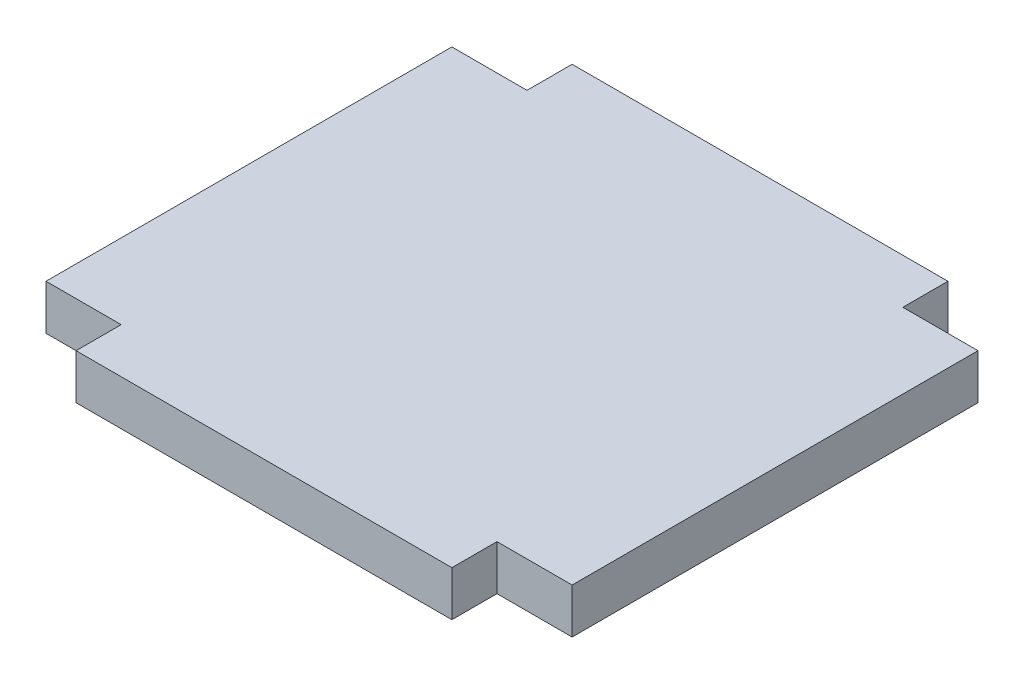
ISO-10303-21;
HEADER;
FILE_DESCRIPTION(('STEP AP214'),'2;1');
FILE_NAME('part.step','',(''),(''),'','','');
FILE_SCHEMA(('AUTOMOTIVE_DESIGN { 1 0 10303 214 1 1 1 1 }'));
ENDSEC;
DATA;
#1=APPLICATION_CONTEXT('core data for automotive mechanical design processes');
#2=APPLICATION_PROTOCOL_DEFINITION('international standard','automotive_design',2000,#1);
#3=PRODUCT_CONTEXT('',#1,'mechanical');
#4=PRODUCT('Part','Part','',(#3));
#5=PRODUCT_RELATED_PRODUCT_CATEGORY('part','',(#4));
#6=PRODUCT_DEFINITION_FORMATION('','',#4);
#7=PRODUCT_DEFINITION_CONTEXT('part definition',#1,'design');
#8=PRODUCT_DEFINITION('design','',#6,#7);
#9=PRODUCT_DEFINITION_SHAPE('','',#8);
#10=(LENGTH_UNIT() NAMED_UNIT(*) SI_UNIT(.MILLI.,.METRE.));
#11=(NAMED_UNIT(*) PLANE_ANGLE_UNIT() SI_UNIT($,.RADIAN.));
#12=(NAMED_UNIT(*) SI_UNIT($,.STERADIAN.) SOLID_ANGLE_UNIT());
#13=UNCERTAINTY_MEASURE_WITH_UNIT(LENGTH_MEASURE(1.E-05),#10,'distance_accuracy_value','');
#14=(GEOMETRIC_REPRESENTATION_CONTEXT(3) GLOBAL_UNCERTAINTY_ASSIGNED_CONTEXT((#13)) GLOBAL_UNIT_ASSIGNED_CONTEXT((#10,
#11,#12)) REPRESENTATION_CONTEXT('',''));
#15=CARTESIAN_POINT('',(0.,0.,0.));
#16=DIRECTION('',(0.,0.,1.));
#17=DIRECTION('',(1.,0.,0.));
#18=AXIS2_PLACEMENT_3D('',#15,#16,#17);
#19=CARTESIAN_POINT('',(23.,-53.,55.1793566240283));
#20=DIRECTION('',(1.,0.,0.));
#21=DIRECTION('',(0.,0.,-1.));
#22=AXIS2_PLACEMENT_3D('',#19,#20,#21);
#23=PLANE('',#22);
#24=DIRECTION('',(0.,0.,-1.));
#25=VECTOR('',#24,1.);
#26=CARTESIAN_POINT('',(23.,-56.,55.1793566240283));
#27=LINE('',#26,#25);
#28=CARTESIAN_POINT('',(23.,-56.,0.));
#29=VERTEX_POINT('',#28);
#30=CARTESIAN_POINT('',(23.,-56.,-3.));
#31=VERTEX_POINT('',#30);
#32=EDGE_CURVE('E369',#29,#31,#27,.T.);
#33=ORIENTED_EDGE('',*,*,#32,.F.);
#34=DIRECTION('',(0.,1.,0.));
#35=VECTOR('',#34,1.);
#36=CARTESIAN_POINT('',(23.,-53.,0.));
#37=LINE('',#36,#35);
#38=CARTESIAN_POINT('',(23.,-53.,0.));
#39=VERTEX_POINT('',#38);
#40=EDGE_CURVE('E161',#29,#39,#37,.T.);
#41=ORIENTED_EDGE('',*,*,#40,.T.);
#42=DIRECTION('',(0.,0.,-1.));
#43=VECTOR('',#42,1.);
#44=CARTESIAN_POINT('',(23.,-53.,55.1793566240283));
#45=LINE('',#44,#43);
#46=CARTESIAN_POINT('',(23.,-53.,-3.00000000000001));
#47=VERTEX_POINT('',#46);
#48=EDGE_CURVE('E210',#39,#47,#45,.T.);
#49=ORIENTED_EDGE('',*,*,#48,.T.);
#50=DIRECTION('',(0.,1.,0.));
#51=VECTOR('',#50,1.);
#52=CARTESIAN_POINT('',(23.,-53.,-3.));
#53=LINE('',#52,#51);
#54=EDGE_CURVE('E318',#31,#47,#53,.T.);
#55=ORIENTED_EDGE('',*,*,#54,.F.);
#56=EDGE_LOOP('',(#33,#41,#49,#55));
#57=FACE_BOUND('',#56,.T.);
#58=ADVANCED_FACE('F39',(#57),#23,.F.);
#59=CARTESIAN_POINT('',(48.,-53.,55.1793566240283));
#60=DIRECTION('',(-1.,0.,0.));
#61=DIRECTION('',(0.,0.,1.));
#62=AXIS2_PLACEMENT_3D('',#59,#60,#61);
#63=PLANE('',#62);
#64=DIRECTION('',(0.,1.,0.));
#65=VECTOR('',#64,1.);
#66=CARTESIAN_POINT('',(48.,-53.,0.));
#67=LINE('',#66,#65);
#68=CARTESIAN_POINT('',(48.,-56.,0.));
#69=VERTEX_POINT('',#68);
#70=CARTESIAN_POINT('',(48.,-53.,0.));
#71=VERTEX_POINT('',#70);
#72=EDGE_CURVE('E70',#69,#71,#67,.T.);
#73=ORIENTED_EDGE('',*,*,#72,.F.);
#74=DIRECTION('',(0.,0.,-1.));
#75=VECTOR('',#74,1.);
#76=CARTESIAN_POINT('',(48.,-56.,55.1793566240283));
#77=LINE('',#76,#75);
#78=CARTESIAN_POINT('',(48.,-56.,-3.));
#79=VERTEX_POINT('',#78);
#80=EDGE_CURVE('E349',#69,#79,#77,.T.);
#81=ORIENTED_EDGE('',*,*,#80,.T.);
#82=DIRECTION('',(0.,-1.,0.));
#83=VECTOR('',#82,1.);
#84=CARTESIAN_POINT('',(48.,-53.,-3.));
#85=LINE('',#84,#83);
#86=CARTESIAN_POINT('',(48.,-53.,-3.));
#87=VERTEX_POINT('',#86);
#88=EDGE_CURVE('E371',#87,#79,#85,.T.);
#89=ORIENTED_EDGE('',*,*,#88,.F.);
#90=DIRECTION('',(0.,0.,-1.));
#91=VECTOR('',#90,1.);
#92=CARTESIAN_POINT('',(48.,-53.,55.1793566240283));
#93=LINE('',#92,#91);
#94=EDGE_CURVE('E229',#71,#87,#93,.T.);
#95=ORIENTED_EDGE('',*,*,#94,.F.);
#96=EDGE_LOOP('',(#73,#81,#89,#95));
#97=FACE_BOUND('',#96,.T.);
#98=ADVANCED_FACE('F41',(#97),#63,.F.);
#99=DIRECTION('',(0.,-1.,0.));
#100=VECTOR('',#99,1.);
#101=CARTESIAN_POINT('',(48.,-53.,27.));
#102=LINE('',#101,#100);
#103=CARTESIAN_POINT('',(48.,-53.,27.));
#104=VERTEX_POINT('',#103);
#105=CARTESIAN_POINT('',(48.,-56.,27.));
#106=VERTEX_POINT('',#105);
#107=EDGE_CURVE('E315',#104,#106,#102,.T.);
#108=ORIENTED_EDGE('',*,*,#107,.F.);
#109=CARTESIAN_POINT('',(48.,-53.,30.));
#110=VERTEX_POINT('',#109);
#111=EDGE_CURVE('E231',#110,#104,#93,.T.);
#112=ORIENTED_EDGE('',*,*,#111,.F.);
#113=DIRECTION('',(0.,-1.,0.));
#114=VECTOR('',#113,1.);
#115=CARTESIAN_POINT('',(48.,-53.,30.));
#116=LINE('',#115,#114);
#117=CARTESIAN_POINT('',(48.,-56.,30.));
#118=VERTEX_POINT('',#117);
#119=EDGE_CURVE('E11',#110,#118,#116,.T.);
#120=ORIENTED_EDGE('',*,*,#119,.T.);
#121=EDGE_CURVE('E367',#118,#106,#77,.T.);
#122=ORIENTED_EDGE('',*,*,#121,.T.);
#123=EDGE_LOOP('',(#108,#112,#120,#122));
#124=FACE_BOUND('',#123,.T.);
#125=ADVANCED_FACE('F274',(#124),#63,.F.);
#126=CARTESIAN_POINT('',(48.,-56.,55.1793566240283));
#127=DIRECTION('',(0.,1.,0.));
#128=DIRECTION('',(-1.,0.,0.));
#129=AXIS2_PLACEMENT_3D('',#126,#127,#128);
#130=PLANE('',#129);
#131=ORIENTED_EDGE('',*,*,#121,.F.);
#132=DIRECTION('',(-1.,0.,0.));
#133=VECTOR('',#132,1.);
#134=CARTESIAN_POINT('',(48.,-56.,30.));
#135=LINE('',#134,#133);
#136=CARTESIAN_POINT('',(23.,-56.,30.));
#137=VERTEX_POINT('',#136);
#138=EDGE_CURVE('E225',#118,#137,#135,.T.);
#139=ORIENTED_EDGE('',*,*,#138,.T.);
#140=CARTESIAN_POINT('',(23.,-56.,27.));
#141=VERTEX_POINT('',#140);
#142=EDGE_CURVE('E215',#137,#141,#27,.T.);
#143=ORIENTED_EDGE('',*,*,#142,.T.);
#144=DIRECTION('',(1.,0.,0.));
#145=VECTOR('',#144,1.);
#146=CARTESIAN_POINT('',(18.,-56.,27.));
#147=LINE('',#146,#145);
#148=CARTESIAN_POINT('',(18.,-56.,27.));
#149=VERTEX_POINT('',#148);
#150=EDGE_CURVE('E60',#149,#141,#147,.T.);
#151=ORIENTED_EDGE('',*,*,#150,.F.);
#152=DIRECTION('',(0.,0.,-1.));
#153=VECTOR('',#152,1.);
#154=CARTESIAN_POINT('',(18.,-56.,0.));
#155=LINE('',#154,#153);
#156=CARTESIAN_POINT('',(18.,-56.,0.));
#157=VERTEX_POINT('',#156);
#158=EDGE_CURVE('E170',#149,#157,#155,.T.);
#159=ORIENTED_EDGE('',*,*,#158,.T.);
#160=DIRECTION('',(1.,0.,0.));
#161=VECTOR('',#160,1.);
#162=CARTESIAN_POINT('',(18.,-56.,0.));
#163=LINE('',#162,#161);
#164=EDGE_CURVE('E155',#157,#29,#163,.T.);
#165=ORIENTED_EDGE('',*,*,#164,.T.);
#166=ORIENTED_EDGE('',*,*,#32,.T.);
#167=DIRECTION('',(-1.,0.,0.));
#168=VECTOR('',#167,1.);
#169=CARTESIAN_POINT('',(48.,-56.,-3.));
#170=LINE('',#169,#168);
#171=EDGE_CURVE('E324',#79,#31,#170,.T.);
#172=ORIENTED_EDGE('',*,*,#171,.F.);
#173=ORIENTED_EDGE('',*,*,#80,.F.);
#174=DIRECTION('',(-1.,0.,0.));
#175=VECTOR('',#174,1.);
#176=CARTESIAN_POINT('',(53.,-56.,0.));
#177=LINE('',#176,#175);
#178=CARTESIAN_POINT('',(53.,-56.,0.));
#179=VERTEX_POINT('',#178);
#180=EDGE_CURVE('E336',#179,#69,#177,.T.);
#181=ORIENTED_EDGE('',*,*,#180,.F.);
#182=DIRECTION('',(0.,0.,-1.));
#183=VECTOR('',#182,1.);
#184=CARTESIAN_POINT('',(53.,-56.,0.));
#185=LINE('',#184,#183);
#186=CARTESIAN_POINT('',(53.,-56.,27.));
#187=VERTEX_POINT('',#186);
#188=EDGE_CURVE('E312',#187,#179,#185,.T.);
#189=ORIENTED_EDGE('',*,*,#188,.F.);
#190=DIRECTION('',(-1.,0.,0.));
#191=VECTOR('',#190,1.);
#192=CARTESIAN_POINT('',(53.,-56.,27.));
#193=LINE('',#192,#191);
#194=EDGE_CURVE('E327',#187,#106,#193,.T.);
#195=ORIENTED_EDGE('',*,*,#194,.T.);
#196=EDGE_LOOP('',(#131,#139,#143,#151,#159,#165,#166,#172,#173,#181,#189,#195));
#197=FACE_BOUND('',#196,.T.);
#198=ADVANCED_FACE('F177',(#197),#130,.F.);
#199=CARTESIAN_POINT('',(23.,-53.,30.));
#200=VERTEX_POINT('',#199);
#201=CARTESIAN_POINT('',(23.,-53.,27.));
#202=VERTEX_POINT('',#201);
#203=EDGE_CURVE('E214',#200,#202,#45,.T.);
#204=ORIENTED_EDGE('',*,*,#203,.T.);
#205=DIRECTION('',(0.,-1.,0.));
#206=VECTOR('',#205,1.);
#207=CARTESIAN_POINT('',(23.,-53.,27.));
#208=LINE('',#207,#206);
#209=EDGE_CURVE('E174',#202,#141,#208,.T.);
#210=ORIENTED_EDGE('',*,*,#209,.T.);
#211=ORIENTED_EDGE('',*,*,#142,.F.);
#212=DIRECTION('',(0.,1.,0.));
#213=VECTOR('',#212,1.);
#214=CARTESIAN_POINT('',(23.,-53.,30.));
#215=LINE('',#214,#213);
#216=EDGE_CURVE('E242',#137,#200,#215,.T.);
#217=ORIENTED_EDGE('',*,*,#216,.T.);
#218=EDGE_LOOP('',(#204,#210,#211,#217));
#219=FACE_BOUND('',#218,.T.);
#220=ADVANCED_FACE('F255',(#219),#23,.F.);
#221=CARTESIAN_POINT('',(48.,-53.,55.1793566240283));
#222=DIRECTION('',(0.,-1.,0.));
#223=DIRECTION('',(0.,0.,-1.));
#224=AXIS2_PLACEMENT_3D('',#221,#222,#223);
#225=PLANE('',#224);
#226=ORIENTED_EDGE('',*,*,#203,.F.);
#227=DIRECTION('',(1.,0.,0.));
#228=VECTOR('',#227,1.);
#229=CARTESIAN_POINT('',(48.,-53.,30.));
#230=LINE('',#229,#228);
#231=EDGE_CURVE('E49',#200,#110,#230,.T.);
#232=ORIENTED_EDGE('',*,*,#231,.T.);
#233=ORIENTED_EDGE('',*,*,#111,.T.);
#234=DIRECTION('',(-1.,0.,0.));
#235=VECTOR('',#234,1.);
#236=CARTESIAN_POINT('',(53.,-53.,27.));
#237=LINE('',#236,#235);
#238=CARTESIAN_POINT('',(53.,-53.,27.));
#239=VERTEX_POINT('',#238);
#240=EDGE_CURVE('E319',#239,#104,#237,.T.);
#241=ORIENTED_EDGE('',*,*,#240,.F.);
#242=DIRECTION('',(0.,0.,1.));
#243=VECTOR('',#242,1.);
#244=CARTESIAN_POINT('',(53.,-53.,0.));
#245=LINE('',#244,#243);
#246=CARTESIAN_POINT('',(53.,-53.,0.));
#247=VERTEX_POINT('',#246);
#248=EDGE_CURVE('E310',#247,#239,#245,.T.);
#249=ORIENTED_EDGE('',*,*,#248,.F.);
#250=DIRECTION('',(-1.,0.,0.));
#251=VECTOR('',#250,1.);
#252=CARTESIAN_POINT('',(53.,-53.,0.));
#253=LINE('',#252,#251);
#254=EDGE_CURVE('E316',#247,#71,#253,.T.);
#255=ORIENTED_EDGE('',*,*,#254,.T.);
#256=ORIENTED_EDGE('',*,*,#94,.T.);
#257=DIRECTION('',(1.,0.,0.));
#258=VECTOR('',#257,1.);
#259=CARTESIAN_POINT('',(48.,-53.,-3.));
#260=LINE('',#259,#258);
#261=EDGE_CURVE('E368',#47,#87,#260,.T.);
#262=ORIENTED_EDGE('',*,*,#261,.F.);
#263=ORIENTED_EDGE('',*,*,#48,.F.);
#264=DIRECTION('',(1.,0.,0.));
#265=VECTOR('',#264,1.);
#266=CARTESIAN_POINT('',(18.,-53.,0.));
#267=LINE('',#266,#265);
#268=CARTESIAN_POINT('',(18.,-53.,0.));
#269=VERTEX_POINT('',#268);
#270=EDGE_CURVE('E187',#269,#39,#267,.T.);
#271=ORIENTED_EDGE('',*,*,#270,.F.);
#272=DIRECTION('',(0.,0.,1.));
#273=VECTOR('',#272,1.);
#274=CARTESIAN_POINT('',(18.,-53.,0.));
#275=LINE('',#274,#273);
#276=CARTESIAN_POINT('',(18.,-53.,27.));
#277=VERTEX_POINT('',#276);
#278=EDGE_CURVE('E172',#269,#277,#275,.T.);
#279=ORIENTED_EDGE('',*,*,#278,.T.);
#280=DIRECTION('',(1.,0.,0.));
#281=VECTOR('',#280,1.);
#282=CARTESIAN_POINT('',(18.,-53.,27.));
#283=LINE('',#282,#281);
#284=EDGE_CURVE('E199',#277,#202,#283,.T.);
#285=ORIENTED_EDGE('',*,*,#284,.T.);
#286=EDGE_LOOP('',(#226,#232,#233,#241,#249,#255,#256,#262,#263,#271,#279,#285));
#287=FACE_BOUND('',#286,.T.);
#288=ADVANCED_FACE('F257',(#287),#225,.F.);
#289=CARTESIAN_POINT('',(35.5,0.,30.));
#290=DIRECTION('',(0.,0.,-1.));
#291=DIRECTION('',(1.,0.,0.));
#292=AXIS2_PLACEMENT_3D('',#289,#290,#291);
#293=PLANE('',#292);
#294=ORIENTED_EDGE('',*,*,#231,.F.);
#295=ORIENTED_EDGE('',*,*,#216,.F.);
#296=ORIENTED_EDGE('',*,*,#138,.F.);
#297=ORIENTED_EDGE('',*,*,#119,.F.);
#298=EDGE_LOOP('',(#294,#295,#296,#297));
#299=FACE_BOUND('',#298,.T.);
#300=ADVANCED_FACE('F281',(#299),#293,.F.);
#301=CARTESIAN_POINT('',(0.,0.,-3.));
#302=DIRECTION('',(0.,0.,1.));
#303=DIRECTION('',(0.,-1.,0.));
#304=AXIS2_PLACEMENT_3D('',#301,#302,#303);
#305=PLANE('',#304);
#306=ORIENTED_EDGE('',*,*,#88,.T.);
#307=ORIENTED_EDGE('',*,*,#171,.T.);
#308=ORIENTED_EDGE('',*,*,#54,.T.);
#309=ORIENTED_EDGE('',*,*,#261,.T.);
#310=EDGE_LOOP('',(#306,#307,#308,#309));
#311=FACE_BOUND('',#310,.T.);
#312=ADVANCED_FACE('F289',(#311),#305,.F.);
#313=CARTESIAN_POINT('',(53.,-53.,0.));
#314=DIRECTION('',(0.,0.,1.));
#315=DIRECTION('',(1.,0.,0.));
#316=AXIS2_PLACEMENT_3D('',#313,#314,#315);
#317=PLANE('',#316);
#318=ORIENTED_EDGE('',*,*,#72,.T.);
#319=ORIENTED_EDGE('',*,*,#254,.F.);
#320=DIRECTION('',(0.,1.,0.));
#321=VECTOR('',#320,1.);
#322=CARTESIAN_POINT('',(53.,-53.,0.));
#323=LINE('',#322,#321);
#324=EDGE_CURVE('E308',#179,#247,#323,.T.);
#325=ORIENTED_EDGE('',*,*,#324,.F.);
#326=ORIENTED_EDGE('',*,*,#180,.T.);
#327=EDGE_LOOP('',(#318,#319,#325,#326));
#328=FACE_BOUND('',#327,.T.);
#329=ADVANCED_FACE('F293',(#328),#317,.F.);
#330=CARTESIAN_POINT('',(53.,-53.,27.));
#331=DIRECTION('',(0.,0.,-1.));
#332=DIRECTION('',(-1.,0.,0.));
#333=AXIS2_PLACEMENT_3D('',#330,#331,#332);
#334=PLANE('',#333);
#335=ORIENTED_EDGE('',*,*,#107,.T.);
#336=ORIENTED_EDGE('',*,*,#194,.F.);
#337=DIRECTION('',(0.,-1.,0.));
#338=VECTOR('',#337,1.);
#339=CARTESIAN_POINT('',(53.,-53.,27.));
#340=LINE('',#339,#338);
#341=EDGE_CURVE('E358',#239,#187,#340,.T.);
#342=ORIENTED_EDGE('',*,*,#341,.F.);
#343=ORIENTED_EDGE('',*,*,#240,.T.);
#344=EDGE_LOOP('',(#335,#336,#342,#343));
#345=FACE_BOUND('',#344,.T.);
#346=ADVANCED_FACE('F297',(#345),#334,.F.);
#347=CARTESIAN_POINT('',(53.,0.,0.));
#348=DIRECTION('',(-1.,0.,0.));
#349=DIRECTION('',(0.,0.,1.));
#350=AXIS2_PLACEMENT_3D('',#347,#348,#349);
#351=PLANE('',#350);
#352=ORIENTED_EDGE('',*,*,#324,.T.);
#353=ORIENTED_EDGE('',*,*,#248,.T.);
#354=ORIENTED_EDGE('',*,*,#341,.T.);
#355=ORIENTED_EDGE('',*,*,#188,.T.);
#356=EDGE_LOOP('',(#352,#353,#354,#355));
#357=FACE_BOUND('',#356,.T.);
#358=ADVANCED_FACE('F266',(#357),#351,.F.);
#359=CARTESIAN_POINT('',(18.,-53.,0.));
#360=DIRECTION('',(0.,0.,-1.));
#361=DIRECTION('',(-1.,0.,0.));
#362=AXIS2_PLACEMENT_3D('',#359,#360,#361);
#363=PLANE('',#362);
#364=ORIENTED_EDGE('',*,*,#40,.F.);
#365=ORIENTED_EDGE('',*,*,#164,.F.);
#366=DIRECTION('',(0.,1.,0.));
#367=VECTOR('',#366,1.);
#368=CARTESIAN_POINT('',(18.,-53.,0.));
#369=LINE('',#368,#367);
#370=EDGE_CURVE('E158',#157,#269,#369,.T.);
#371=ORIENTED_EDGE('',*,*,#370,.T.);
#372=ORIENTED_EDGE('',*,*,#270,.T.);
#373=EDGE_LOOP('',(#364,#365,#371,#372));
#374=FACE_BOUND('',#373,.T.);
#375=ADVANCED_FACE('F157',(#374),#363,.T.);
#376=CARTESIAN_POINT('',(18.,-53.,27.));
#377=DIRECTION('',(0.,0.,1.));
#378=DIRECTION('',(1.,0.,0.));
#379=AXIS2_PLACEMENT_3D('',#376,#377,#378);
#380=PLANE('',#379);
#381=ORIENTED_EDGE('',*,*,#209,.F.);
#382=ORIENTED_EDGE('',*,*,#284,.F.);
#383=DIRECTION('',(0.,-1.,0.));
#384=VECTOR('',#383,1.);
#385=CARTESIAN_POINT('',(18.,-53.,27.));
#386=LINE('',#385,#384);
#387=EDGE_CURVE('E180',#277,#149,#386,.T.);
#388=ORIENTED_EDGE('',*,*,#387,.T.);
#389=ORIENTED_EDGE('',*,*,#150,.T.);
#390=EDGE_LOOP('',(#381,#382,#388,#389));
#391=FACE_BOUND('',#390,.T.);
#392=ADVANCED_FACE('F258',(#391),#380,.T.);
#393=CARTESIAN_POINT('',(18.,0.,0.));
#394=DIRECTION('',(1.,0.,0.));
#395=DIRECTION('',(0.,0.,1.));
#396=AXIS2_PLACEMENT_3D('',#393,#394,#395);
#397=PLANE('',#396);
#398=ORIENTED_EDGE('',*,*,#370,.F.);
#399=ORIENTED_EDGE('',*,*,#158,.F.);
#400=ORIENTED_EDGE('',*,*,#387,.F.);
#401=ORIENTED_EDGE('',*,*,#278,.F.);
#402=EDGE_LOOP('',(#398,#399,#400,#401));
#403=FACE_BOUND('',#402,.T.);
#404=ADVANCED_FACE('F168',(#403),#397,.F.);
#405=CLOSED_SHELL('',(#58,#98,#125,#198,#220,#288,#300,#312,#329,#346,#358,#375,#392,#404));
#406=MANIFOLD_SOLID_BREP('B2',#405);
#407=ADVANCED_BREP_SHAPE_REPRESENTATION('',(#18,#406),#14);
#408=SHAPE_DEFINITION_REPRESENTATION(#9,#407);
ENDSEC;
END-ISO-10303-21;
